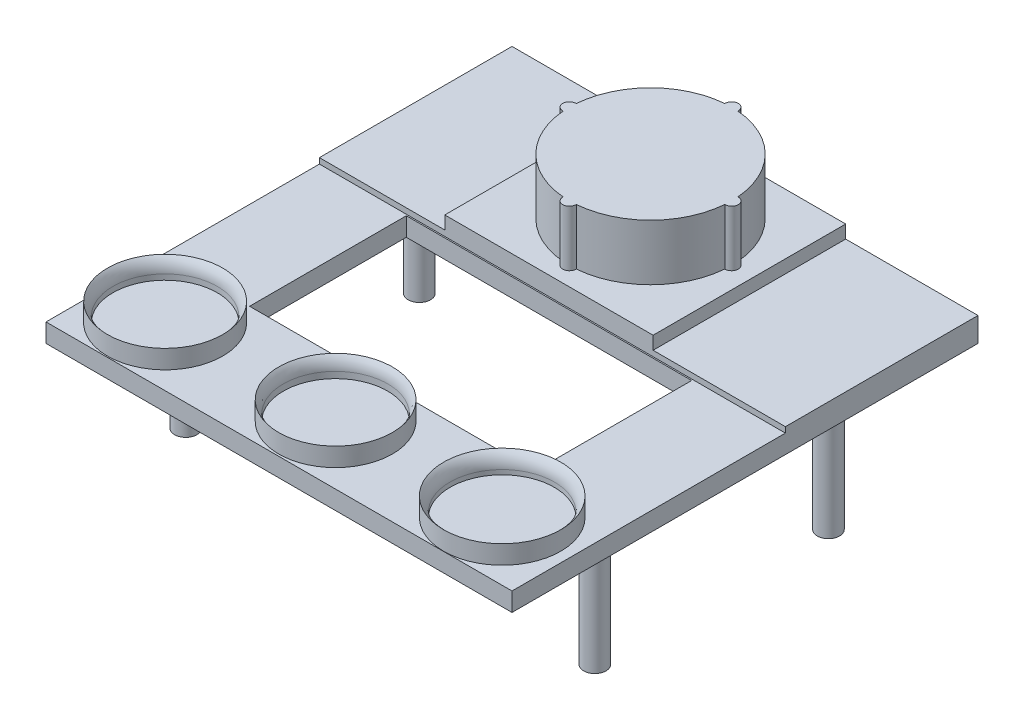
ISO-10303-21;
HEADER;
FILE_DESCRIPTION(('STEP AP214'),'2;1');
FILE_NAME('part.step','',(''),(''),'','','');
FILE_SCHEMA(('AUTOMOTIVE_DESIGN { 1 0 10303 214 1 1 1 1 }'));
ENDSEC;
DATA;
#1=APPLICATION_CONTEXT('core data for automotive mechanical design processes');
#2=APPLICATION_PROTOCOL_DEFINITION('international standard','automotive_design',2000,#1);
#3=PRODUCT_CONTEXT('',#1,'mechanical');
#4=PRODUCT('Part','Part','',(#3));
#5=PRODUCT_RELATED_PRODUCT_CATEGORY('part','',(#4));
#6=PRODUCT_DEFINITION_FORMATION('','',#4);
#7=PRODUCT_DEFINITION_CONTEXT('part definition',#1,'design');
#8=PRODUCT_DEFINITION('design','',#6,#7);
#9=PRODUCT_DEFINITION_SHAPE('','',#8);
#10=(LENGTH_UNIT() NAMED_UNIT(*) SI_UNIT(.MILLI.,.METRE.));
#11=(NAMED_UNIT(*) PLANE_ANGLE_UNIT() SI_UNIT($,.RADIAN.));
#12=(NAMED_UNIT(*) SI_UNIT($,.STERADIAN.) SOLID_ANGLE_UNIT());
#13=UNCERTAINTY_MEASURE_WITH_UNIT(LENGTH_MEASURE(1.E-05),#10,'distance_accuracy_value','');
#14=(GEOMETRIC_REPRESENTATION_CONTEXT(3) GLOBAL_UNCERTAINTY_ASSIGNED_CONTEXT((#13)) GLOBAL_UNIT_ASSIGNED_CONTEXT((#10,
#11,#12)) REPRESENTATION_CONTEXT('',''));
#15=CARTESIAN_POINT('',(0.,0.,0.));
#16=DIRECTION('',(0.,0.,1.));
#17=DIRECTION('',(1.,0.,0.));
#18=AXIS2_PLACEMENT_3D('',#15,#16,#17);
#19=CARTESIAN_POINT('',(0.,13.,0.));
#20=DIRECTION('',(0.,1.,0.));
#21=DIRECTION('',(0.,0.,1.));
#22=AXIS2_PLACEMENT_3D('',#19,#20,#21);
#23=PLANE('',#22);
#24=DIRECTION('',(1.,0.,0.));
#25=VECTOR('',#24,1.);
#26=CARTESIAN_POINT('',(0.,13.,103.325354833291));
#27=LINE('',#26,#25);
#28=CARTESIAN_POINT('',(0.,13.,103.325354833291));
#29=VERTEX_POINT('',#28);
#30=CARTESIAN_POINT('',(67.2573906105652,13.,103.325354833291));
#31=VERTEX_POINT('',#30);
#32=EDGE_CURVE('E243',#29,#31,#27,.T.);
#33=ORIENTED_EDGE('',*,*,#32,.T.);
#34=DIRECTION('',(0.,0.,-1.));
#35=VECTOR('',#34,1.);
#36=CARTESIAN_POINT('',(67.2573906105652,13.,0.));
#37=LINE('',#36,#35);
#38=CARTESIAN_POINT('',(67.2573906105652,13.,0.));
#39=VERTEX_POINT('',#38);
#40=EDGE_CURVE('E11',#31,#39,#37,.T.);
#41=ORIENTED_EDGE('',*,*,#40,.T.);
#42=DIRECTION('',(-1.,0.,0.));
#43=VECTOR('',#42,1.);
#44=CARTESIAN_POINT('',(0.,13.,0.));
#45=LINE('',#44,#43);
#46=CARTESIAN_POINT('',(0.,13.,0.));
#47=VERTEX_POINT('',#46);
#48=EDGE_CURVE('E248',#39,#47,#45,.T.);
#49=ORIENTED_EDGE('',*,*,#48,.T.);
#50=DIRECTION('',(0.,0.,1.));
#51=VECTOR('',#50,1.);
#52=CARTESIAN_POINT('',(0.,13.,0.));
#53=LINE('',#52,#51);
#54=EDGE_CURVE('E239',#47,#29,#53,.T.);
#55=ORIENTED_EDGE('',*,*,#54,.T.);
#56=EDGE_LOOP('',(#33,#41,#49,#55));
#57=FACE_BOUND('',#56,.T.);
#58=ADVANCED_FACE('F37',(#57),#23,.T.);
#59=CARTESIAN_POINT('',(250.,13.,0.));
#60=VERTEX_POINT('',#59);
#61=CARTESIAN_POINT('',(179.017279751407,13.,0.));
#62=VERTEX_POINT('',#61);
#63=EDGE_CURVE('E249',#60,#62,#45,.T.);
#64=ORIENTED_EDGE('',*,*,#63,.T.);
#65=DIRECTION('',(0.,0.,1.));
#66=VECTOR('',#65,1.);
#67=CARTESIAN_POINT('',(179.017279751407,13.,0.));
#68=LINE('',#67,#66);
#69=CARTESIAN_POINT('',(179.017279751407,13.,103.325354833291));
#70=VERTEX_POINT('',#69);
#71=EDGE_CURVE('E45',#62,#70,#68,.T.);
#72=ORIENTED_EDGE('',*,*,#71,.T.);
#73=CARTESIAN_POINT('',(250.,13.,103.325354833291));
#74=VERTEX_POINT('',#73);
#75=EDGE_CURVE('E242',#70,#74,#27,.T.);
#76=ORIENTED_EDGE('',*,*,#75,.T.);
#77=DIRECTION('',(0.,0.,-1.));
#78=VECTOR('',#77,1.);
#79=CARTESIAN_POINT('',(250.,13.,0.));
#80=LINE('',#79,#78);
#81=EDGE_CURVE('E245',#74,#60,#80,.T.);
#82=ORIENTED_EDGE('',*,*,#81,.T.);
#83=EDGE_LOOP('',(#64,#72,#76,#82));
#84=FACE_BOUND('',#83,.T.);
#85=ADVANCED_FACE('F383',(#84),#23,.T.);
#86=CARTESIAN_POINT('',(0.,10.,0.));
#87=DIRECTION('',(0.,1.,0.));
#88=DIRECTION('',(0.,0.,1.));
#89=AXIS2_PLACEMENT_3D('',#86,#87,#88);
#90=PLANE('',#89);
#91=CARTESIAN_POINT('',(213.222579155119,10.,218.471907281431));
#92=DIRECTION('',(0.,1.,0.));
#93=DIRECTION('',(0.,0.,1.));
#94=AXIS2_PLACEMENT_3D('',#91,#92,#93);
#95=CIRCLE('',#94,31.4230528856466);
#96=CARTESIAN_POINT('',(213.222579155119,10.,249.894960167077));
#97=VERTEX_POINT('',#96);
#98=EDGE_CURVE('E259',#97,#97,#95,.T.);
#99=ORIENTED_EDGE('',*,*,#98,.F.);
#100=EDGE_LOOP('',(#99));
#101=FACE_BOUND('',#100,.T.);
#102=CARTESIAN_POINT('',(32.3747585453935,10.,218.471907281431));
#103=DIRECTION('',(0.,1.,0.));
#104=DIRECTION('',(0.,0.,1.));
#105=AXIS2_PLACEMENT_3D('',#102,#103,#104);
#106=CIRCLE('',#105,30.9208109440799);
#107=CARTESIAN_POINT('',(32.3747585453935,10.,249.392718225511));
#108=VERTEX_POINT('',#107);
#109=EDGE_CURVE('E268',#108,#108,#106,.T.);
#110=ORIENTED_EDGE('',*,*,#109,.F.);
#111=EDGE_LOOP('',(#110));
#112=FACE_BOUND('',#111,.T.);
#113=DIRECTION('',(1.,0.,0.));
#114=VECTOR('',#113,1.);
#115=CARTESIAN_POINT('',(47.3310682617749,10.,188.122433439712));
#116=LINE('',#115,#114);
#117=CARTESIAN_POINT('',(126.903959479342,10.,188.122433439712));
#118=VERTEX_POINT('',#117);
#119=CARTESIAN_POINT('',(200.410245688352,10.,188.122433439712));
#120=VERTEX_POINT('',#119);
#121=EDGE_CURVE('E304',#118,#120,#116,.T.);
#122=ORIENTED_EDGE('',*,*,#121,.F.);
#123=CARTESIAN_POINT('',(123.814667842446,10.,218.471907281431));
#124=DIRECTION('',(0.,1.,0.));
#125=DIRECTION('',(0.,0.,1.));
#126=AXIS2_PLACEMENT_3D('',#123,#124,#125);
#127=CIRCLE('',#126,30.5062991083316);
#128=CARTESIAN_POINT('',(120.725376205549,10.,188.122433439712));
#129=VERTEX_POINT('',#128);
#130=EDGE_CURVE('E269',#129,#118,#127,.T.);
#131=ORIENTED_EDGE('',*,*,#130,.F.);
#132=CARTESIAN_POINT('',(47.3310682617749,10.,188.122433439712));
#133=VERTEX_POINT('',#132);
#134=EDGE_CURVE('E306',#133,#129,#116,.T.);
#135=ORIENTED_EDGE('',*,*,#134,.F.);
#136=DIRECTION('',(0.,0.,1.));
#137=VECTOR('',#136,1.);
#138=CARTESIAN_POINT('',(47.3310682617749,10.,104.023379174493));
#139=LINE('',#138,#137);
#140=CARTESIAN_POINT('',(47.3310682617749,10.,104.023379174493));
#141=VERTEX_POINT('',#140);
#142=EDGE_CURVE('E302',#141,#133,#139,.T.);
#143=ORIENTED_EDGE('',*,*,#142,.F.);
#144=DIRECTION('',(-1.,0.,0.));
#145=VECTOR('',#144,1.);
#146=CARTESIAN_POINT('',(47.3310682617749,10.,104.023379174493));
#147=LINE('',#146,#145);
#148=CARTESIAN_POINT('',(200.410245688352,10.,104.023379174493));
#149=VERTEX_POINT('',#148);
#150=EDGE_CURVE('E313',#149,#141,#147,.T.);
#151=ORIENTED_EDGE('',*,*,#150,.F.);
#152=DIRECTION('',(0.,0.,-1.));
#153=VECTOR('',#152,1.);
#154=CARTESIAN_POINT('',(200.410245688352,10.,104.023379174493));
#155=LINE('',#154,#153);
#156=EDGE_CURVE('E309',#120,#149,#155,.T.);
#157=ORIENTED_EDGE('',*,*,#156,.F.);
#158=EDGE_LOOP('',(#122,#131,#135,#143,#151,#157));
#159=FACE_BOUND('',#158,.T.);
#160=DIRECTION('',(0.,0.,-1.));
#161=VECTOR('',#160,1.);
#162=CARTESIAN_POINT('',(250.,10.,0.));
#163=LINE('',#162,#161);
#164=CARTESIAN_POINT('',(250.,10.,250.));
#165=VERTEX_POINT('',#164);
#166=CARTESIAN_POINT('',(250.,10.,103.325354833291));
#167=VERTEX_POINT('',#166);
#168=EDGE_CURVE('E341',#165,#167,#163,.T.);
#169=ORIENTED_EDGE('',*,*,#168,.T.);
#170=DIRECTION('',(1.,0.,0.));
#171=VECTOR('',#170,1.);
#172=CARTESIAN_POINT('',(0.,10.,103.325354833291));
#173=LINE('',#172,#171);
#174=CARTESIAN_POINT('',(0.,10.,103.325354833291));
#175=VERTEX_POINT('',#174);
#176=EDGE_CURVE('E238',#175,#167,#173,.T.);
#177=ORIENTED_EDGE('',*,*,#176,.F.);
#178=DIRECTION('',(0.,0.,1.));
#179=VECTOR('',#178,1.);
#180=CARTESIAN_POINT('',(0.,10.,0.));
#181=LINE('',#180,#179);
#182=CARTESIAN_POINT('',(0.,10.,250.));
#183=VERTEX_POINT('',#182);
#184=EDGE_CURVE('E336',#175,#183,#181,.T.);
#185=ORIENTED_EDGE('',*,*,#184,.T.);
#186=DIRECTION('',(1.,0.,0.));
#187=VECTOR('',#186,1.);
#188=CARTESIAN_POINT('',(0.,10.,250.));
#189=LINE('',#188,#187);
#190=EDGE_CURVE('E338',#183,#165,#189,.T.);
#191=ORIENTED_EDGE('',*,*,#190,.T.);
#192=EDGE_LOOP('',(#169,#177,#185,#191));
#193=FACE_BOUND('',#192,.T.);
#194=ADVANCED_FACE('F413',(#101,#112,#159,#193),#90,.T.);
#195=CARTESIAN_POINT('',(0.,0.,0.));
#196=DIRECTION('',(0.,1.,0.));
#197=DIRECTION('',(0.,0.,1.));
#198=AXIS2_PLACEMENT_3D('',#195,#196,#197);
#199=PLANE('',#198);
#200=DIRECTION('',(0.,0.,1.));
#201=VECTOR('',#200,1.);
#202=CARTESIAN_POINT('',(0.,0.,0.));
#203=LINE('',#202,#201);
#204=CARTESIAN_POINT('',(0.,0.,0.));
#205=VERTEX_POINT('',#204);
#206=CARTESIAN_POINT('',(0.,0.,250.));
#207=VERTEX_POINT('',#206);
#208=EDGE_CURVE('E335',#205,#207,#203,.T.);
#209=ORIENTED_EDGE('',*,*,#208,.F.);
#210=DIRECTION('',(-1.,0.,0.));
#211=VECTOR('',#210,1.);
#212=CARTESIAN_POINT('',(0.,0.,0.));
#213=LINE('',#212,#211);
#214=CARTESIAN_POINT('',(250.,0.,0.));
#215=VERTEX_POINT('',#214);
#216=EDGE_CURVE('E339',#215,#205,#213,.T.);
#217=ORIENTED_EDGE('',*,*,#216,.F.);
#218=DIRECTION('',(0.,0.,-1.));
#219=VECTOR('',#218,1.);
#220=CARTESIAN_POINT('',(250.,0.,0.));
#221=LINE('',#220,#219);
#222=CARTESIAN_POINT('',(250.,0.,250.));
#223=VERTEX_POINT('',#222);
#224=EDGE_CURVE('E349',#223,#215,#221,.T.);
#225=ORIENTED_EDGE('',*,*,#224,.F.);
#226=DIRECTION('',(1.,0.,0.));
#227=VECTOR('',#226,1.);
#228=CARTESIAN_POINT('',(0.,0.,250.));
#229=LINE('',#228,#227);
#230=EDGE_CURVE('E347',#207,#223,#229,.T.);
#231=ORIENTED_EDGE('',*,*,#230,.F.);
#232=EDGE_LOOP('',(#209,#217,#225,#231));
#233=FACE_BOUND('',#232,.T.);
#234=DIRECTION('',(0.,0.,1.));
#235=VECTOR('',#234,1.);
#236=CARTESIAN_POINT('',(47.3310682617749,0.,104.023379174493));
#237=LINE('',#236,#235);
#238=CARTESIAN_POINT('',(47.3310682617749,0.,104.023379174493));
#239=VERTEX_POINT('',#238);
#240=CARTESIAN_POINT('',(47.3310682617749,0.,188.122433439712));
#241=VERTEX_POINT('',#240);
#242=EDGE_CURVE('E299',#239,#241,#237,.T.);
#243=ORIENTED_EDGE('',*,*,#242,.T.);
#244=DIRECTION('',(1.,0.,0.));
#245=VECTOR('',#244,1.);
#246=CARTESIAN_POINT('',(47.3310682617749,0.,188.122433439712));
#247=LINE('',#246,#245);
#248=CARTESIAN_POINT('',(200.410245688352,0.,188.122433439712));
#249=VERTEX_POINT('',#248);
#250=EDGE_CURVE('E318',#241,#249,#247,.T.);
#251=ORIENTED_EDGE('',*,*,#250,.T.);
#252=DIRECTION('',(0.,0.,-1.));
#253=VECTOR('',#252,1.);
#254=CARTESIAN_POINT('',(200.410245688352,0.,104.023379174493));
#255=LINE('',#254,#253);
#256=CARTESIAN_POINT('',(200.410245688352,0.,104.023379174493));
#257=VERTEX_POINT('',#256);
#258=EDGE_CURVE('E321',#249,#257,#255,.T.);
#259=ORIENTED_EDGE('',*,*,#258,.T.);
#260=DIRECTION('',(-1.,0.,0.));
#261=VECTOR('',#260,1.);
#262=CARTESIAN_POINT('',(47.3310682617749,0.,104.023379174493));
#263=LINE('',#262,#261);
#264=EDGE_CURVE('E305',#257,#239,#263,.T.);
#265=ORIENTED_EDGE('',*,*,#264,.T.);
#266=EDGE_LOOP('',(#243,#251,#259,#265));
#267=FACE_BOUND('',#266,.T.);
#268=CARTESIAN_POINT('',(11.9090744526915,0.,61.6016628873772));
#269=DIRECTION('',(0.,1.,0.));
#270=DIRECTION('',(0.,0.,1.));
#271=AXIS2_PLACEMENT_3D('',#268,#269,#270);
#272=CIRCLE('',#271,6.);
#273=CARTESIAN_POINT('',(11.9090744526915,0.,67.6016628873772));
#274=VERTEX_POINT('',#273);
#275=EDGE_CURVE('E293',#274,#274,#272,.T.);
#276=ORIENTED_EDGE('',*,*,#275,.T.);
#277=EDGE_LOOP('',(#276));
#278=FACE_BOUND('',#277,.T.);
#279=CARTESIAN_POINT('',(231.364856765617,0.,61.6016628873772));
#280=DIRECTION('',(0.,1.,0.));
#281=DIRECTION('',(0.,0.,1.));
#282=AXIS2_PLACEMENT_3D('',#279,#280,#281);
#283=CIRCLE('',#282,6.00000000000002);
#284=CARTESIAN_POINT('',(231.364856765617,0.,67.6016628873772));
#285=VERTEX_POINT('',#284);
#286=EDGE_CURVE('E290',#285,#285,#283,.T.);
#287=ORIENTED_EDGE('',*,*,#286,.T.);
#288=EDGE_LOOP('',(#287));
#289=FACE_BOUND('',#288,.T.);
#290=CARTESIAN_POINT('',(231.364856765617,0.,186.93529856387));
#291=DIRECTION('',(0.,1.,0.));
#292=DIRECTION('',(0.,0.,1.));
#293=AXIS2_PLACEMENT_3D('',#290,#291,#292);
#294=CIRCLE('',#293,6.00000000000002);
#295=CARTESIAN_POINT('',(231.364856765617,0.,192.93529856387));
#296=VERTEX_POINT('',#295);
#297=EDGE_CURVE('E284',#296,#296,#294,.T.);
#298=ORIENTED_EDGE('',*,*,#297,.T.);
#299=EDGE_LOOP('',(#298));
#300=FACE_BOUND('',#299,.T.);
#301=CARTESIAN_POINT('',(11.9090744526915,0.,186.93529856387));
#302=DIRECTION('',(0.,1.,0.));
#303=DIRECTION('',(0.,0.,1.));
#304=AXIS2_PLACEMENT_3D('',#301,#302,#303);
#305=CIRCLE('',#304,6.);
#306=CARTESIAN_POINT('',(11.9090744526915,0.,192.93529856387));
#307=VERTEX_POINT('',#306);
#308=EDGE_CURVE('E278',#307,#307,#305,.T.);
#309=ORIENTED_EDGE('',*,*,#308,.T.);
#310=EDGE_LOOP('',(#309));
#311=FACE_BOUND('',#310,.T.);
#312=ADVANCED_FACE('F423',(#233,#267,#278,#289,#300,#311),#199,.F.);
#313=CARTESIAN_POINT('',(0.,10.,0.));
#314=DIRECTION('',(1.,0.,0.));
#315=DIRECTION('',(0.,0.,-1.));
#316=AXIS2_PLACEMENT_3D('',#313,#314,#315);
#317=PLANE('',#316);
#318=ORIENTED_EDGE('',*,*,#208,.T.);
#319=DIRECTION('',(0.,-1.,0.));
#320=VECTOR('',#319,1.);
#321=CARTESIAN_POINT('',(0.,10.,250.));
#322=LINE('',#321,#320);
#323=EDGE_CURVE('E360',#183,#207,#322,.T.);
#324=ORIENTED_EDGE('',*,*,#323,.F.);
#325=ORIENTED_EDGE('',*,*,#184,.F.);
#326=DIRECTION('',(0.,-1.,0.));
#327=VECTOR('',#326,1.);
#328=CARTESIAN_POINT('',(0.,13.,103.325354833291));
#329=LINE('',#328,#327);
#330=EDGE_CURVE('E255',#29,#175,#329,.T.);
#331=ORIENTED_EDGE('',*,*,#330,.F.);
#332=ORIENTED_EDGE('',*,*,#54,.F.);
#333=DIRECTION('',(0.,-1.,0.));
#334=VECTOR('',#333,1.);
#335=CARTESIAN_POINT('',(0.,10.,0.));
#336=LINE('',#335,#334);
#337=EDGE_CURVE('E344',#47,#205,#336,.T.);
#338=ORIENTED_EDGE('',*,*,#337,.T.);
#339=EDGE_LOOP('',(#318,#324,#325,#331,#332,#338));
#340=FACE_BOUND('',#339,.T.);
#341=ADVANCED_FACE('F409',(#340),#317,.F.);
#342=CARTESIAN_POINT('',(0.,10.,250.));
#343=DIRECTION('',(0.,0.,-1.));
#344=DIRECTION('',(-1.,0.,0.));
#345=AXIS2_PLACEMENT_3D('',#342,#343,#344);
#346=PLANE('',#345);
#347=ORIENTED_EDGE('',*,*,#230,.T.);
#348=DIRECTION('',(0.,-1.,0.));
#349=VECTOR('',#348,1.);
#350=CARTESIAN_POINT('',(250.,10.,250.));
#351=LINE('',#350,#349);
#352=EDGE_CURVE('E357',#165,#223,#351,.T.);
#353=ORIENTED_EDGE('',*,*,#352,.F.);
#354=ORIENTED_EDGE('',*,*,#190,.F.);
#355=ORIENTED_EDGE('',*,*,#323,.T.);
#356=EDGE_LOOP('',(#347,#353,#354,#355));
#357=FACE_BOUND('',#356,.T.);
#358=ADVANCED_FACE('F427',(#357),#346,.F.);
#359=CARTESIAN_POINT('',(250.,10.,0.));
#360=DIRECTION('',(-1.,0.,0.));
#361=DIRECTION('',(0.,0.,1.));
#362=AXIS2_PLACEMENT_3D('',#359,#360,#361);
#363=PLANE('',#362);
#364=ORIENTED_EDGE('',*,*,#224,.T.);
#365=DIRECTION('',(0.,-1.,0.));
#366=VECTOR('',#365,1.);
#367=CARTESIAN_POINT('',(250.,10.,0.));
#368=LINE('',#367,#366);
#369=EDGE_CURVE('E354',#60,#215,#368,.T.);
#370=ORIENTED_EDGE('',*,*,#369,.F.);
#371=ORIENTED_EDGE('',*,*,#81,.F.);
#372=DIRECTION('',(0.,-1.,0.));
#373=VECTOR('',#372,1.);
#374=CARTESIAN_POINT('',(250.,13.,103.325354833291));
#375=LINE('',#374,#373);
#376=EDGE_CURVE('E251',#74,#167,#375,.T.);
#377=ORIENTED_EDGE('',*,*,#376,.T.);
#378=ORIENTED_EDGE('',*,*,#168,.F.);
#379=ORIENTED_EDGE('',*,*,#352,.T.);
#380=EDGE_LOOP('',(#364,#370,#371,#377,#378,#379));
#381=FACE_BOUND('',#380,.T.);
#382=ADVANCED_FACE('F417',(#381),#363,.F.);
#383=CARTESIAN_POINT('',(0.,10.,0.));
#384=DIRECTION('',(0.,0.,1.));
#385=DIRECTION('',(1.,0.,0.));
#386=AXIS2_PLACEMENT_3D('',#383,#384,#385);
#387=PLANE('',#386);
#388=ORIENTED_EDGE('',*,*,#216,.T.);
#389=ORIENTED_EDGE('',*,*,#337,.F.);
#390=ORIENTED_EDGE('',*,*,#48,.F.);
#391=DIRECTION('',(0.,-1.,0.));
#392=VECTOR('',#391,1.);
#393=CARTESIAN_POINT('',(67.2573906105652,20.,0.));
#394=LINE('',#393,#392);
#395=CARTESIAN_POINT('',(67.2573906105652,20.,0.));
#396=VERTEX_POINT('',#395);
#397=EDGE_CURVE('E226',#396,#39,#394,.T.);
#398=ORIENTED_EDGE('',*,*,#397,.F.);
#399=DIRECTION('',(-1.,0.,0.));
#400=VECTOR('',#399,1.);
#401=CARTESIAN_POINT('',(67.2573906105652,20.,0.));
#402=LINE('',#401,#400);
#403=CARTESIAN_POINT('',(179.017279751407,20.,0.));
#404=VERTEX_POINT('',#403);
#405=EDGE_CURVE('E224',#404,#396,#402,.T.);
#406=ORIENTED_EDGE('',*,*,#405,.F.);
#407=DIRECTION('',(0.,-1.,0.));
#408=VECTOR('',#407,1.);
#409=CARTESIAN_POINT('',(179.017279751407,20.,0.));
#410=LINE('',#409,#408);
#411=EDGE_CURVE('E229',#404,#62,#410,.T.);
#412=ORIENTED_EDGE('',*,*,#411,.T.);
#413=ORIENTED_EDGE('',*,*,#63,.F.);
#414=ORIENTED_EDGE('',*,*,#369,.T.);
#415=EDGE_LOOP('',(#388,#389,#390,#398,#406,#412,#413,#414));
#416=FACE_BOUND('',#415,.T.);
#417=ADVANCED_FACE('F419',(#416),#387,.F.);
#418=CARTESIAN_POINT('',(47.3310682617749,10.,104.023379174493));
#419=DIRECTION('',(1.,0.,0.));
#420=DIRECTION('',(0.,0.,-1.));
#421=AXIS2_PLACEMENT_3D('',#418,#419,#420);
#422=PLANE('',#421);
#423=ORIENTED_EDGE('',*,*,#242,.F.);
#424=DIRECTION('',(0.,-1.,0.));
#425=VECTOR('',#424,1.);
#426=CARTESIAN_POINT('',(47.3310682617749,10.,104.023379174493));
#427=LINE('',#426,#425);
#428=EDGE_CURVE('E315',#141,#239,#427,.T.);
#429=ORIENTED_EDGE('',*,*,#428,.F.);
#430=ORIENTED_EDGE('',*,*,#142,.T.);
#431=DIRECTION('',(0.,-1.,0.));
#432=VECTOR('',#431,1.);
#433=CARTESIAN_POINT('',(47.3310682617749,10.,188.122433439712));
#434=LINE('',#433,#432);
#435=EDGE_CURVE('E332',#133,#241,#434,.T.);
#436=ORIENTED_EDGE('',*,*,#435,.T.);
#437=EDGE_LOOP('',(#423,#429,#430,#436));
#438=FACE_BOUND('',#437,.T.);
#439=ADVANCED_FACE('F520',(#438),#422,.T.);
#440=CARTESIAN_POINT('',(47.3310682617749,10.,188.122433439712));
#441=DIRECTION('',(0.,0.,-1.));
#442=DIRECTION('',(-1.,0.,0.));
#443=AXIS2_PLACEMENT_3D('',#440,#441,#442);
#444=PLANE('',#443);
#445=ORIENTED_EDGE('',*,*,#250,.F.);
#446=ORIENTED_EDGE('',*,*,#435,.F.);
#447=ORIENTED_EDGE('',*,*,#134,.T.);
#448=EDGE_CURVE('E310',#129,#118,#116,.T.);
#449=ORIENTED_EDGE('',*,*,#448,.T.);
#450=ORIENTED_EDGE('',*,*,#121,.T.);
#451=DIRECTION('',(0.,-1.,0.));
#452=VECTOR('',#451,1.);
#453=CARTESIAN_POINT('',(200.410245688352,10.,188.122433439712));
#454=LINE('',#453,#452);
#455=EDGE_CURVE('E330',#120,#249,#454,.T.);
#456=ORIENTED_EDGE('',*,*,#455,.T.);
#457=EDGE_LOOP('',(#445,#446,#447,#449,#450,#456));
#458=FACE_BOUND('',#457,.T.);
#459=ADVANCED_FACE('F516',(#458),#444,.T.);
#460=CARTESIAN_POINT('',(200.410245688352,10.,104.023379174493));
#461=DIRECTION('',(-1.,0.,0.));
#462=DIRECTION('',(0.,0.,1.));
#463=AXIS2_PLACEMENT_3D('',#460,#461,#462);
#464=PLANE('',#463);
#465=ORIENTED_EDGE('',*,*,#258,.F.);
#466=ORIENTED_EDGE('',*,*,#455,.F.);
#467=ORIENTED_EDGE('',*,*,#156,.T.);
#468=DIRECTION('',(0.,-1.,0.));
#469=VECTOR('',#468,1.);
#470=CARTESIAN_POINT('',(200.410245688352,10.,104.023379174493));
#471=LINE('',#470,#469);
#472=EDGE_CURVE('E328',#149,#257,#471,.T.);
#473=ORIENTED_EDGE('',*,*,#472,.T.);
#474=EDGE_LOOP('',(#465,#466,#467,#473));
#475=FACE_BOUND('',#474,.T.);
#476=ADVANCED_FACE('F512',(#475),#464,.T.);
#477=CARTESIAN_POINT('',(47.3310682617749,10.,104.023379174493));
#478=DIRECTION('',(0.,0.,1.));
#479=DIRECTION('',(1.,0.,0.));
#480=AXIS2_PLACEMENT_3D('',#477,#478,#479);
#481=PLANE('',#480);
#482=ORIENTED_EDGE('',*,*,#264,.F.);
#483=ORIENTED_EDGE('',*,*,#472,.F.);
#484=ORIENTED_EDGE('',*,*,#150,.T.);
#485=ORIENTED_EDGE('',*,*,#428,.T.);
#486=EDGE_LOOP('',(#482,#483,#484,#485));
#487=FACE_BOUND('',#486,.T.);
#488=ADVANCED_FACE('F508',(#487),#481,.T.);
#489=CARTESIAN_POINT('',(11.9090744526915,-65.,61.6016628873772));
#490=DIRECTION('',(0.,1.,0.));
#491=DIRECTION('',(0.,0.,1.));
#492=AXIS2_PLACEMENT_3D('',#489,#490,#491);
#493=CYLINDRICAL_SURFACE('',#492,6.);
#494=CARTESIAN_POINT('',(11.9090744526915,-65.,61.6016628873772));
#495=DIRECTION('',(0.,1.,0.));
#496=DIRECTION('',(0.,0.,1.));
#497=AXIS2_PLACEMENT_3D('',#494,#495,#496);
#498=CIRCLE('',#497,6.);
#499=CARTESIAN_POINT('',(11.9090744526915,-65.,67.6016628873772));
#500=VERTEX_POINT('',#499);
#501=EDGE_CURVE('E296',#500,#500,#498,.T.);
#502=ORIENTED_EDGE('',*,*,#501,.T.);
#503=EDGE_LOOP('',(#502));
#504=FACE_BOUND('',#503,.T.);
#505=ORIENTED_EDGE('',*,*,#275,.F.);
#506=EDGE_LOOP('',(#505));
#507=FACE_BOUND('',#506,.T.);
#508=ADVANCED_FACE('F504',(#504,#507),#493,.T.);
#509=CARTESIAN_POINT('',(11.9090744526915,-65.,61.6016628873772));
#510=DIRECTION('',(0.,1.,0.));
#511=DIRECTION('',(0.,0.,1.));
#512=AXIS2_PLACEMENT_3D('',#509,#510,#511);
#513=PLANE('',#512);
#514=ORIENTED_EDGE('',*,*,#501,.F.);
#515=EDGE_LOOP('',(#514));
#516=FACE_BOUND('',#515,.T.);
#517=ADVANCED_FACE('F497',(#516),#513,.F.);
#518=CARTESIAN_POINT('',(231.364856765617,-65.,61.6016628873772));
#519=DIRECTION('',(0.,1.,0.));
#520=DIRECTION('',(0.,0.,1.));
#521=AXIS2_PLACEMENT_3D('',#518,#519,#520);
#522=CYLINDRICAL_SURFACE('',#521,6.00000000000002);
#523=CARTESIAN_POINT('',(231.364856765617,-65.,61.6016628873772));
#524=DIRECTION('',(0.,1.,0.));
#525=DIRECTION('',(0.,0.,1.));
#526=AXIS2_PLACEMENT_3D('',#523,#524,#525);
#527=CIRCLE('',#526,6.00000000000002);
#528=CARTESIAN_POINT('',(231.364856765617,-65.,67.6016628873772));
#529=VERTEX_POINT('',#528);
#530=EDGE_CURVE('E287',#529,#529,#527,.T.);
#531=ORIENTED_EDGE('',*,*,#530,.T.);
#532=EDGE_LOOP('',(#531));
#533=FACE_BOUND('',#532,.T.);
#534=ORIENTED_EDGE('',*,*,#286,.F.);
#535=EDGE_LOOP('',(#534));
#536=FACE_BOUND('',#535,.T.);
#537=ADVANCED_FACE('F494',(#533,#536),#522,.T.);
#538=CARTESIAN_POINT('',(231.364856765617,-65.,61.6016628873772));
#539=DIRECTION('',(0.,1.,0.));
#540=DIRECTION('',(0.,0.,1.));
#541=AXIS2_PLACEMENT_3D('',#538,#539,#540);
#542=PLANE('',#541);
#543=ORIENTED_EDGE('',*,*,#530,.F.);
#544=EDGE_LOOP('',(#543));
#545=FACE_BOUND('',#544,.T.);
#546=ADVANCED_FACE('F489',(#545),#542,.F.);
#547=CARTESIAN_POINT('',(231.364856765617,-65.,186.93529856387));
#548=DIRECTION('',(0.,1.,0.));
#549=DIRECTION('',(0.,0.,1.));
#550=AXIS2_PLACEMENT_3D('',#547,#548,#549);
#551=CYLINDRICAL_SURFACE('',#550,6.00000000000002);
#552=CARTESIAN_POINT('',(231.364856765617,-65.,186.93529856387));
#553=DIRECTION('',(0.,1.,0.));
#554=DIRECTION('',(0.,0.,1.));
#555=AXIS2_PLACEMENT_3D('',#552,#553,#554);
#556=CIRCLE('',#555,6.00000000000002);
#557=CARTESIAN_POINT('',(231.364856765617,-65.,192.93529856387));
#558=VERTEX_POINT('',#557);
#559=EDGE_CURVE('E281',#558,#558,#556,.T.);
#560=ORIENTED_EDGE('',*,*,#559,.T.);
#561=EDGE_LOOP('',(#560));
#562=FACE_BOUND('',#561,.T.);
#563=ORIENTED_EDGE('',*,*,#297,.F.);
#564=EDGE_LOOP('',(#563));
#565=FACE_BOUND('',#564,.T.);
#566=ADVANCED_FACE('F486',(#562,#565),#551,.T.);
#567=CARTESIAN_POINT('',(231.364856765617,-65.,186.93529856387));
#568=DIRECTION('',(0.,1.,0.));
#569=DIRECTION('',(0.,0.,1.));
#570=AXIS2_PLACEMENT_3D('',#567,#568,#569);
#571=PLANE('',#570);
#572=ORIENTED_EDGE('',*,*,#559,.F.);
#573=EDGE_LOOP('',(#572));
#574=FACE_BOUND('',#573,.T.);
#575=ADVANCED_FACE('F481',(#574),#571,.F.);
#576=CARTESIAN_POINT('',(11.9090744526915,-65.,186.93529856387));
#577=DIRECTION('',(0.,1.,0.));
#578=DIRECTION('',(0.,0.,1.));
#579=AXIS2_PLACEMENT_3D('',#576,#577,#578);
#580=CYLINDRICAL_SURFACE('',#579,6.);
#581=CARTESIAN_POINT('',(11.9090744526915,-65.,186.93529856387));
#582=DIRECTION('',(0.,1.,0.));
#583=DIRECTION('',(0.,0.,1.));
#584=AXIS2_PLACEMENT_3D('',#581,#582,#583);
#585=CIRCLE('',#584,6.);
#586=CARTESIAN_POINT('',(11.9090744526915,-65.,192.93529856387));
#587=VERTEX_POINT('',#586);
#588=EDGE_CURVE('E275',#587,#587,#585,.T.);
#589=ORIENTED_EDGE('',*,*,#588,.T.);
#590=EDGE_LOOP('',(#589));
#591=FACE_BOUND('',#590,.T.);
#592=ORIENTED_EDGE('',*,*,#308,.F.);
#593=EDGE_LOOP('',(#592));
#594=FACE_BOUND('',#593,.T.);
#595=ADVANCED_FACE('F478',(#591,#594),#580,.T.);
#596=CARTESIAN_POINT('',(11.9090744526915,-65.,186.93529856387));
#597=DIRECTION('',(0.,1.,0.));
#598=DIRECTION('',(0.,0.,1.));
#599=AXIS2_PLACEMENT_3D('',#596,#597,#598);
#600=PLANE('',#599);
#601=ORIENTED_EDGE('',*,*,#588,.F.);
#602=EDGE_LOOP('',(#601));
#603=FACE_BOUND('',#602,.T.);
#604=ADVANCED_FACE('F476',(#603),#600,.F.);
#605=CARTESIAN_POINT('',(32.3747585453935,20.,218.471907281431));
#606=DIRECTION('',(0.,-1.,0.));
#607=DIRECTION('',(0.,0.,-1.));
#608=AXIS2_PLACEMENT_3D('',#605,#606,#607);
#609=CYLINDRICAL_SURFACE('',#608,30.9208109440799);
#610=CARTESIAN_POINT('',(32.3747585453935,20.,218.471907281431));
#611=DIRECTION('',(0.,1.,0.));
#612=DIRECTION('',(0.,0.,1.));
#613=AXIS2_PLACEMENT_3D('',#610,#611,#612);
#614=CIRCLE('',#613,30.9208109440799);
#615=CARTESIAN_POINT('',(32.3747585453935,20.,249.392718225511));
#616=VERTEX_POINT('',#615);
#617=EDGE_CURVE('E272',#616,#616,#614,.T.);
#618=ORIENTED_EDGE('',*,*,#617,.F.);
#619=EDGE_LOOP('',(#618));
#620=FACE_BOUND('',#619,.T.);
#621=ORIENTED_EDGE('',*,*,#109,.T.);
#622=EDGE_LOOP('',(#621));
#623=FACE_BOUND('',#622,.T.);
#624=ADVANCED_FACE('F472',(#620,#623),#609,.T.);
#625=CARTESIAN_POINT('',(32.3747585453935,20.,218.471907281431));
#626=DIRECTION('',(0.,-1.,0.));
#627=DIRECTION('',(0.,0.,-1.));
#628=AXIS2_PLACEMENT_3D('',#625,#626,#627);
#629=CYLINDRICAL_SURFACE('',#628,28.);
#630=CARTESIAN_POINT('',(32.3747585453935,12.93706277031,218.471907281431));
#631=DIRECTION('',(0.,1.,0.));
#632=DIRECTION('',(0.,0.,1.));
#633=AXIS2_PLACEMENT_3D('',#630,#631,#632);
#634=CIRCLE('',#633,28.);
#635=CARTESIAN_POINT('',(32.3747585453935,12.93706277031,246.471907281431));
#636=VERTEX_POINT('',#635);
#637=EDGE_CURVE('E378',#636,#636,#634,.T.);
#638=ORIENTED_EDGE('',*,*,#637,.T.);
#639=EDGE_LOOP('',(#638));
#640=FACE_BOUND('',#639,.T.);
#641=CARTESIAN_POINT('',(32.3747585453935,10.,218.471907281431));
#642=DIRECTION('',(0.,1.,0.));
#643=DIRECTION('',(0.,0.,1.));
#644=AXIS2_PLACEMENT_3D('',#641,#642,#643);
#645=CIRCLE('',#644,28.);
#646=CARTESIAN_POINT('',(32.3747585453935,10.,246.471907281431));
#647=VERTEX_POINT('',#646);
#648=EDGE_CURVE('E363',#647,#647,#645,.F.);
#649=ORIENTED_EDGE('',*,*,#648,.T.);
#650=EDGE_LOOP('',(#649));
#651=FACE_BOUND('',#650,.T.);
#652=ADVANCED_FACE('F469',(#640,#651),#629,.F.);
#653=ORIENTED_EDGE('',*,*,#648,.F.);
#654=EDGE_LOOP('',(#653));
#655=FACE_BOUND('',#654,.T.);
#656=ADVANCED_FACE('F464',(#655),#90,.T.);
#657=CARTESIAN_POINT('',(123.814667842446,10.,218.471907281431));
#658=DIRECTION('',(0.,1.,0.));
#659=DIRECTION('',(0.,0.,1.));
#660=AXIS2_PLACEMENT_3D('',#657,#658,#659);
#661=PLANE('',#660);
#662=ORIENTED_EDGE('',*,*,#448,.F.);
#663=EDGE_CURVE('E265',#118,#129,#127,.T.);
#664=ORIENTED_EDGE('',*,*,#663,.F.);
#665=EDGE_LOOP('',(#662,#664));
#666=FACE_BOUND('',#665,.T.);
#667=ADVANCED_FACE('F460',(#666),#661,.F.);
#668=CARTESIAN_POINT('',(123.814667842446,20.,218.471907281431));
#669=DIRECTION('',(0.,-1.,0.));
#670=DIRECTION('',(0.,0.,-1.));
#671=AXIS2_PLACEMENT_3D('',#668,#669,#670);
#672=CYLINDRICAL_SURFACE('',#671,30.5062991083316);
#673=CARTESIAN_POINT('',(123.814667842446,20.,218.471907281431));
#674=DIRECTION('',(0.,1.,0.));
#675=DIRECTION('',(0.,0.,1.));
#676=AXIS2_PLACEMENT_3D('',#673,#674,#675);
#677=CIRCLE('',#676,30.5062991083316);
#678=CARTESIAN_POINT('',(123.814667842446,20.,248.978206389762));
#679=VERTEX_POINT('',#678);
#680=EDGE_CURVE('E262',#679,#679,#677,.T.);
#681=ORIENTED_EDGE('',*,*,#680,.F.);
#682=EDGE_LOOP('',(#681));
#683=FACE_BOUND('',#682,.T.);
#684=ORIENTED_EDGE('',*,*,#663,.T.);
#685=ORIENTED_EDGE('',*,*,#130,.T.);
#686=EDGE_LOOP('',(#684,#685));
#687=FACE_BOUND('',#686,.T.);
#688=ADVANCED_FACE('F456',(#683,#687),#672,.T.);
#689=CARTESIAN_POINT('',(123.814667842446,20.,218.471907281431));
#690=DIRECTION('',(0.,-1.,0.));
#691=DIRECTION('',(0.,0.,-1.));
#692=AXIS2_PLACEMENT_3D('',#689,#690,#691);
#693=CYLINDRICAL_SURFACE('',#692,28.);
#694=CARTESIAN_POINT('',(123.814667842446,13.3784860533102,218.471907281431));
#695=DIRECTION('',(0.,1.,0.));
#696=DIRECTION('',(0.,0.,1.));
#697=AXIS2_PLACEMENT_3D('',#694,#695,#696);
#698=CIRCLE('',#697,28.);
#699=CARTESIAN_POINT('',(123.814667842446,13.3784860533102,246.471907281431));
#700=VERTEX_POINT('',#699);
#701=EDGE_CURVE('E375',#700,#700,#698,.T.);
#702=ORIENTED_EDGE('',*,*,#701,.T.);
#703=EDGE_LOOP('',(#702));
#704=FACE_BOUND('',#703,.T.);
#705=CARTESIAN_POINT('',(123.814667842446,10.,218.471907281431));
#706=DIRECTION('',(0.,1.,0.));
#707=DIRECTION('',(0.,0.,1.));
#708=AXIS2_PLACEMENT_3D('',#705,#706,#707);
#709=CIRCLE('',#708,28.);
#710=CARTESIAN_POINT('',(123.814667842446,10.,246.471907281431));
#711=VERTEX_POINT('',#710);
#712=EDGE_CURVE('E366',#711,#711,#709,.F.);
#713=ORIENTED_EDGE('',*,*,#712,.T.);
#714=EDGE_LOOP('',(#713));
#715=FACE_BOUND('',#714,.T.);
#716=ADVANCED_FACE('F459',(#704,#715),#693,.F.);
#717=ORIENTED_EDGE('',*,*,#712,.F.);
#718=EDGE_LOOP('',(#717));
#719=FACE_BOUND('',#718,.T.);
#720=ADVANCED_FACE('F450',(#719),#90,.T.);
#721=CARTESIAN_POINT('',(213.222579155119,20.,218.471907281431));
#722=DIRECTION('',(0.,-1.,0.));
#723=DIRECTION('',(0.,0.,-1.));
#724=AXIS2_PLACEMENT_3D('',#721,#722,#723);
#725=CYLINDRICAL_SURFACE('',#724,31.4230528856466);
#726=CARTESIAN_POINT('',(213.222579155119,20.,218.471907281431));
#727=DIRECTION('',(0.,1.,0.));
#728=DIRECTION('',(0.,0.,1.));
#729=AXIS2_PLACEMENT_3D('',#726,#727,#728);
#730=CIRCLE('',#729,31.4230528856466);
#731=CARTESIAN_POINT('',(213.222579155119,20.,249.894960167077));
#732=VERTEX_POINT('',#731);
#733=EDGE_CURVE('E258',#732,#732,#730,.T.);
#734=ORIENTED_EDGE('',*,*,#733,.F.);
#735=EDGE_LOOP('',(#734));
#736=FACE_BOUND('',#735,.T.);
#737=ORIENTED_EDGE('',*,*,#98,.T.);
#738=EDGE_LOOP('',(#737));
#739=FACE_BOUND('',#738,.T.);
#740=ADVANCED_FACE('F446',(#736,#739),#725,.T.);
#741=CARTESIAN_POINT('',(213.222579155119,20.,218.471907281431));
#742=DIRECTION('',(0.,-1.,0.));
#743=DIRECTION('',(0.,0.,-1.));
#744=AXIS2_PLACEMENT_3D('',#741,#742,#743);
#745=CYLINDRICAL_SURFACE('',#744,28.);
#746=CARTESIAN_POINT('',(213.222579155119,12.4671541463403,218.471907281431));
#747=DIRECTION('',(0.,1.,0.));
#748=DIRECTION('',(0.,0.,1.));
#749=AXIS2_PLACEMENT_3D('',#746,#747,#748);
#750=CIRCLE('',#749,28.);
#751=CARTESIAN_POINT('',(213.222579155119,12.4671541463403,246.471907281431));
#752=VERTEX_POINT('',#751);
#753=EDGE_CURVE('E372',#752,#752,#750,.T.);
#754=ORIENTED_EDGE('',*,*,#753,.T.);
#755=EDGE_LOOP('',(#754));
#756=FACE_BOUND('',#755,.T.);
#757=CARTESIAN_POINT('',(213.222579155119,10.,218.471907281431));
#758=DIRECTION('',(0.,1.,0.));
#759=DIRECTION('',(0.,0.,1.));
#760=AXIS2_PLACEMENT_3D('',#757,#758,#759);
#761=CIRCLE('',#760,28.);
#762=CARTESIAN_POINT('',(213.222579155119,10.,246.471907281431));
#763=VERTEX_POINT('',#762);
#764=EDGE_CURVE('E369',#763,#763,#761,.F.);
#765=ORIENTED_EDGE('',*,*,#764,.T.);
#766=EDGE_LOOP('',(#765));
#767=FACE_BOUND('',#766,.T.);
#768=ADVANCED_FACE('F449',(#756,#767),#745,.F.);
#769=ORIENTED_EDGE('',*,*,#764,.F.);
#770=EDGE_LOOP('',(#769));
#771=FACE_BOUND('',#770,.T.);
#772=ADVANCED_FACE('F454',(#771),#90,.T.);
#773=CARTESIAN_POINT('',(213.222579155119,12.4671541463403,218.471907281431));
#774=DIRECTION('',(0.,1.,0.));
#775=DIRECTION('',(0.,0.,1.));
#776=AXIS2_PLACEMENT_3D('',#773,#774,#775);
#777=TOROIDAL_SURFACE('',#776,38.,10.);
#778=ORIENTED_EDGE('',*,*,#733,.T.);
#779=EDGE_LOOP('',(#778));
#780=FACE_BOUND('',#779,.T.);
#781=ORIENTED_EDGE('',*,*,#753,.F.);
#782=EDGE_LOOP('',(#781));
#783=FACE_BOUND('',#782,.T.);
#784=ADVANCED_FACE('F632',(#780,#783),#777,.T.);
#785=CARTESIAN_POINT('',(123.814667842446,13.3784860533102,218.471907281431));
#786=DIRECTION('',(0.,1.,0.));
#787=DIRECTION('',(0.,0.,1.));
#788=AXIS2_PLACEMENT_3D('',#785,#786,#787);
#789=TOROIDAL_SURFACE('',#788,38.,10.);
#790=ORIENTED_EDGE('',*,*,#680,.T.);
#791=EDGE_LOOP('',(#790));
#792=FACE_BOUND('',#791,.T.);
#793=ORIENTED_EDGE('',*,*,#701,.F.);
#794=EDGE_LOOP('',(#793));
#795=FACE_BOUND('',#794,.T.);
#796=ADVANCED_FACE('F638',(#792,#795),#789,.T.);
#797=CARTESIAN_POINT('',(32.3747585453935,12.93706277031,218.471907281431));
#798=DIRECTION('',(0.,1.,0.));
#799=DIRECTION('',(0.,0.,1.));
#800=AXIS2_PLACEMENT_3D('',#797,#798,#799);
#801=TOROIDAL_SURFACE('',#800,38.,10.);
#802=ORIENTED_EDGE('',*,*,#617,.T.);
#803=EDGE_LOOP('',(#802));
#804=FACE_BOUND('',#803,.T.);
#805=ORIENTED_EDGE('',*,*,#637,.F.);
#806=EDGE_LOOP('',(#805));
#807=FACE_BOUND('',#806,.T.);
#808=ADVANCED_FACE('F39',(#804,#807),#801,.T.);
#809=CARTESIAN_POINT('',(0.,13.,103.325354833291));
#810=DIRECTION('',(0.,0.,-1.));
#811=DIRECTION('',(-1.,0.,0.));
#812=AXIS2_PLACEMENT_3D('',#809,#810,#811);
#813=PLANE('',#812);
#814=ORIENTED_EDGE('',*,*,#176,.T.);
#815=ORIENTED_EDGE('',*,*,#376,.F.);
#816=ORIENTED_EDGE('',*,*,#75,.F.);
#817=DIRECTION('',(0.,-1.,0.));
#818=VECTOR('',#817,1.);
#819=CARTESIAN_POINT('',(179.017279751407,20.,103.325354833291));
#820=LINE('',#819,#818);
#821=CARTESIAN_POINT('',(179.017279751407,20.,103.325354833291));
#822=VERTEX_POINT('',#821);
#823=EDGE_CURVE('E232',#822,#70,#820,.T.);
#824=ORIENTED_EDGE('',*,*,#823,.F.);
#825=DIRECTION('',(1.,0.,0.));
#826=VECTOR('',#825,1.);
#827=CARTESIAN_POINT('',(67.2573906105652,20.,103.325354833291));
#828=LINE('',#827,#826);
#829=CARTESIAN_POINT('',(67.2573906105652,20.,103.325354833291));
#830=VERTEX_POINT('',#829);
#831=EDGE_CURVE('E215',#830,#822,#828,.T.);
#832=ORIENTED_EDGE('',*,*,#831,.F.);
#833=DIRECTION('',(0.,-1.,0.));
#834=VECTOR('',#833,1.);
#835=CARTESIAN_POINT('',(67.2573906105652,20.,103.325354833291));
#836=LINE('',#835,#834);
#837=EDGE_CURVE('E235',#830,#31,#836,.T.);
#838=ORIENTED_EDGE('',*,*,#837,.T.);
#839=ORIENTED_EDGE('',*,*,#32,.F.);
#840=ORIENTED_EDGE('',*,*,#330,.T.);
#841=EDGE_LOOP('',(#814,#815,#816,#824,#832,#838,#839,#840));
#842=FACE_BOUND('',#841,.T.);
#843=ADVANCED_FACE('F390',(#842),#813,.F.);
#844=CARTESIAN_POINT('',(67.2573906105652,20.,0.));
#845=DIRECTION('',(1.,0.,0.));
#846=DIRECTION('',(0.,0.,-1.));
#847=AXIS2_PLACEMENT_3D('',#844,#845,#846);
#848=PLANE('',#847);
#849=ORIENTED_EDGE('',*,*,#40,.F.);
#850=ORIENTED_EDGE('',*,*,#837,.F.);
#851=DIRECTION('',(0.,0.,1.));
#852=VECTOR('',#851,1.);
#853=CARTESIAN_POINT('',(67.2573906105652,20.,0.));
#854=LINE('',#853,#852);
#855=EDGE_CURVE('E212',#396,#830,#854,.T.);
#856=ORIENTED_EDGE('',*,*,#855,.F.);
#857=ORIENTED_EDGE('',*,*,#397,.T.);
#858=EDGE_LOOP('',(#849,#850,#856,#857));
#859=FACE_BOUND('',#858,.T.);
#860=ADVANCED_FACE('F402',(#859),#848,.F.);
#861=CARTESIAN_POINT('',(179.017279751407,20.,0.));
#862=DIRECTION('',(-1.,0.,0.));
#863=DIRECTION('',(0.,0.,1.));
#864=AXIS2_PLACEMENT_3D('',#861,#862,#863);
#865=PLANE('',#864);
#866=ORIENTED_EDGE('',*,*,#71,.F.);
#867=ORIENTED_EDGE('',*,*,#411,.F.);
#868=DIRECTION('',(0.,0.,-1.));
#869=VECTOR('',#868,1.);
#870=CARTESIAN_POINT('',(179.017279751407,20.,0.));
#871=LINE('',#870,#869);
#872=EDGE_CURVE('E222',#822,#404,#871,.T.);
#873=ORIENTED_EDGE('',*,*,#872,.F.);
#874=ORIENTED_EDGE('',*,*,#823,.T.);
#875=EDGE_LOOP('',(#866,#867,#873,#874));
#876=FACE_BOUND('',#875,.T.);
#877=ADVANCED_FACE('F393',(#876),#865,.F.);
#878=CARTESIAN_POINT('',(0.,20.,0.));
#879=DIRECTION('',(0.,1.,0.));
#880=DIRECTION('',(0.,0.,1.));
#881=AXIS2_PLACEMENT_3D('',#878,#879,#880);
#882=PLANE('',#881);
#883=CARTESIAN_POINT('',(124.135837763779,20.,49.8272382866092));
#884=DIRECTION('',(0.,1.,0.));
#885=DIRECTION('',(0.,0.,1.));
#886=AXIS2_PLACEMENT_3D('',#883,#884,#885);
#887=CIRCLE('',#886,43.509860609965);
#888=CARTESIAN_POINT('',(127.670631708799,20.,93.1932757129736));
#889=VERTEX_POINT('',#888);
#890=CARTESIAN_POINT('',(167.501875190143,20.,53.3620322316292));
#891=VERTEX_POINT('',#890);
#892=EDGE_CURVE('E52',#889,#891,#887,.T.);
#893=ORIENTED_EDGE('',*,*,#892,.F.);
#894=CARTESIAN_POINT('',(124.135837763779,20.,93.3370988965742));
#895=DIRECTION('',(0.,1.,0.));
#896=DIRECTION('',(0.,0.,1.));
#897=AXIS2_PLACEMENT_3D('',#894,#895,#896);
#898=CIRCLE('',#897,3.53771866347377);
#899=CARTESIAN_POINT('',(120.601043818759,20.,93.1932757129736));
#900=VERTEX_POINT('',#899);
#901=EDGE_CURVE('E56',#900,#889,#898,.T.);
#902=ORIENTED_EDGE('',*,*,#901,.F.);
#903=CARTESIAN_POINT('',(124.135837763779,20.,49.8272382866092));
#904=DIRECTION('',(0.,1.,0.));
#905=DIRECTION('',(0.,0.,1.));
#906=AXIS2_PLACEMENT_3D('',#903,#904,#905);
#907=CIRCLE('',#906,43.509860609965);
#908=CARTESIAN_POINT('',(80.7698003374147,20.,53.3620322316291));
#909=VERTEX_POINT('',#908);
#910=EDGE_CURVE('E963',#909,#900,#907,.T.);
#911=ORIENTED_EDGE('',*,*,#910,.F.);
#912=CARTESIAN_POINT('',(80.6259771538141,20.,49.8272382866092));
#913=DIRECTION('',(0.,1.,0.));
#914=DIRECTION('',(0.,0.,1.));
#915=AXIS2_PLACEMENT_3D('',#912,#913,#914);
#916=CIRCLE('',#915,3.53771866347378);
#917=CARTESIAN_POINT('',(80.7698003374147,20.,46.2924443415893));
#918=VERTEX_POINT('',#917);
#919=EDGE_CURVE('E997',#918,#909,#916,.T.);
#920=ORIENTED_EDGE('',*,*,#919,.F.);
#921=CARTESIAN_POINT('',(124.135837763779,20.,49.8272382866092));
#922=DIRECTION('',(0.,1.,0.));
#923=DIRECTION('',(0.,0.,1.));
#924=AXIS2_PLACEMENT_3D('',#921,#922,#923);
#925=CIRCLE('',#924,43.509860609965);
#926=CARTESIAN_POINT('',(120.601043818759,20.,6.46120086024487));
#927=VERTEX_POINT('',#926);
#928=EDGE_CURVE('E990',#927,#918,#925,.T.);
#929=ORIENTED_EDGE('',*,*,#928,.F.);
#930=CARTESIAN_POINT('',(124.135837763779,20.,6.31737767664423));
#931=DIRECTION('',(0.,1.,0.));
#932=DIRECTION('',(0.,0.,1.));
#933=AXIS2_PLACEMENT_3D('',#930,#931,#932);
#934=CIRCLE('',#933,3.53771866347377);
#935=CARTESIAN_POINT('',(127.670631708799,20.,6.46120086024487));
#936=VERTEX_POINT('',#935);
#937=EDGE_CURVE('E984',#936,#927,#934,.T.);
#938=ORIENTED_EDGE('',*,*,#937,.F.);
#939=CARTESIAN_POINT('',(124.135837763779,20.,49.8272382866092));
#940=DIRECTION('',(0.,1.,0.));
#941=DIRECTION('',(0.,0.,1.));
#942=AXIS2_PLACEMENT_3D('',#939,#940,#941);
#943=CIRCLE('',#942,43.509860609965);
#944=CARTESIAN_POINT('',(167.501875190143,20.,46.2924443415893));
#945=VERTEX_POINT('',#944);
#946=EDGE_CURVE('E987',#945,#936,#943,.T.);
#947=ORIENTED_EDGE('',*,*,#946,.F.);
#948=CARTESIAN_POINT('',(167.645698373744,20.,49.8272382866092));
#949=DIRECTION('',(0.,1.,0.));
#950=DIRECTION('',(0.,0.,1.));
#951=AXIS2_PLACEMENT_3D('',#948,#949,#950);
#952=CIRCLE('',#951,3.53771866347381);
#953=EDGE_CURVE('E988',#891,#945,#952,.T.);
#954=ORIENTED_EDGE('',*,*,#953,.F.);
#955=EDGE_LOOP('',(#893,#902,#911,#920,#929,#938,#947,#954));
#956=FACE_BOUND('',#955,.T.);
#957=ORIENTED_EDGE('',*,*,#855,.T.);
#958=ORIENTED_EDGE('',*,*,#831,.T.);
#959=ORIENTED_EDGE('',*,*,#872,.T.);
#960=ORIENTED_EDGE('',*,*,#405,.T.);
#961=EDGE_LOOP('',(#957,#958,#959,#960));
#962=FACE_BOUND('',#961,.T.);
#963=ADVANCED_FACE('F396',(#956,#962),#882,.T.);
#964=CARTESIAN_POINT('',(124.135837763779,50.,49.8272382866092));
#965=DIRECTION('',(0.,-1.,0.));
#966=DIRECTION('',(0.,0.,-1.));
#967=AXIS2_PLACEMENT_3D('',#964,#965,#966);
#968=CYLINDRICAL_SURFACE('',#967,43.509860609965);
#969=ORIENTED_EDGE('',*,*,#892,.T.);
#970=DIRECTION('',(0.,-1.,0.));
#971=VECTOR('',#970,1.);
#972=CARTESIAN_POINT('',(167.501875190143,50.,53.3620322316292));
#973=LINE('',#972,#971);
#974=CARTESIAN_POINT('',(167.501875190143,50.,53.3620322316292));
#975=VERTEX_POINT('',#974);
#976=EDGE_CURVE('E195',#975,#891,#973,.T.);
#977=ORIENTED_EDGE('',*,*,#976,.F.);
#978=CARTESIAN_POINT('',(124.135837763779,50.,49.8272382866092));
#979=DIRECTION('',(0.,1.,0.));
#980=DIRECTION('',(0.,0.,1.));
#981=AXIS2_PLACEMENT_3D('',#978,#979,#980);
#982=CIRCLE('',#981,43.509860609965);
#983=CARTESIAN_POINT('',(127.670631708799,50.,93.1932757129736));
#984=VERTEX_POINT('',#983);
#985=EDGE_CURVE('E201',#984,#975,#982,.T.);
#986=ORIENTED_EDGE('',*,*,#985,.F.);
#987=DIRECTION('',(0.,-1.,0.));
#988=VECTOR('',#987,1.);
#989=CARTESIAN_POINT('',(127.670631708799,50.,93.1932757129736));
#990=LINE('',#989,#988);
#991=EDGE_CURVE('E960',#984,#889,#990,.T.);
#992=ORIENTED_EDGE('',*,*,#991,.T.);
#993=EDGE_LOOP('',(#969,#977,#986,#992));
#994=FACE_BOUND('',#993,.T.);
#995=ADVANCED_FACE('F211',(#994),#968,.T.);
#996=CARTESIAN_POINT('',(167.645698373744,50.,49.8272382866092));
#997=DIRECTION('',(0.,-1.,0.));
#998=DIRECTION('',(0.,0.,-1.));
#999=AXIS2_PLACEMENT_3D('',#996,#997,#998);
#1000=CYLINDRICAL_SURFACE('',#999,3.53771866347381);
#1001=ORIENTED_EDGE('',*,*,#953,.T.);
#1002=DIRECTION('',(0.,-1.,0.));
#1003=VECTOR('',#1002,1.);
#1004=CARTESIAN_POINT('',(167.501875190143,50.,46.2924443415893));
#1005=LINE('',#1004,#1003);
#1006=CARTESIAN_POINT('',(167.501875190143,50.,46.2924443415893));
#1007=VERTEX_POINT('',#1006);
#1008=EDGE_CURVE('E197',#1007,#945,#1005,.T.);
#1009=ORIENTED_EDGE('',*,*,#1008,.F.);
#1010=CARTESIAN_POINT('',(167.645698373744,50.,49.8272382866092));
#1011=DIRECTION('',(0.,1.,0.));
#1012=DIRECTION('',(0.,0.,1.));
#1013=AXIS2_PLACEMENT_3D('',#1010,#1011,#1012);
#1014=CIRCLE('',#1013,3.53771866347381);
#1015=EDGE_CURVE('E190',#975,#1007,#1014,.T.);
#1016=ORIENTED_EDGE('',*,*,#1015,.F.);
#1017=ORIENTED_EDGE('',*,*,#976,.T.);
#1018=EDGE_LOOP('',(#1001,#1009,#1016,#1017));
#1019=FACE_BOUND('',#1018,.T.);
#1020=ADVANCED_FACE('F193',(#1019),#1000,.T.);
#1021=CARTESIAN_POINT('',(124.135837763779,50.,49.8272382866092));
#1022=DIRECTION('',(0.,-1.,0.));
#1023=DIRECTION('',(0.,0.,-1.));
#1024=AXIS2_PLACEMENT_3D('',#1021,#1022,#1023);
#1025=CYLINDRICAL_SURFACE('',#1024,43.509860609965);
#1026=ORIENTED_EDGE('',*,*,#946,.T.);
#1027=DIRECTION('',(0.,-1.,0.));
#1028=VECTOR('',#1027,1.);
#1029=CARTESIAN_POINT('',(127.670631708799,50.,6.46120086024487));
#1030=LINE('',#1029,#1028);
#1031=CARTESIAN_POINT('',(127.670631708799,50.,6.46120086024487));
#1032=VERTEX_POINT('',#1031);
#1033=EDGE_CURVE('E217',#1032,#936,#1030,.T.);
#1034=ORIENTED_EDGE('',*,*,#1033,.F.);
#1035=CARTESIAN_POINT('',(124.135837763779,50.,49.8272382866092));
#1036=DIRECTION('',(0.,1.,0.));
#1037=DIRECTION('',(0.,0.,1.));
#1038=AXIS2_PLACEMENT_3D('',#1035,#1036,#1037);
#1039=CIRCLE('',#1038,43.509860609965);
#1040=EDGE_CURVE('E200',#1007,#1032,#1039,.T.);
#1041=ORIENTED_EDGE('',*,*,#1040,.F.);
#1042=ORIENTED_EDGE('',*,*,#1008,.T.);
#1043=EDGE_LOOP('',(#1026,#1034,#1041,#1042));
#1044=FACE_BOUND('',#1043,.T.);
#1045=ADVANCED_FACE('F684',(#1044),#1025,.T.);
#1046=CARTESIAN_POINT('',(124.135837763779,50.,6.31737767664423));
#1047=DIRECTION('',(0.,-1.,0.));
#1048=DIRECTION('',(0.,0.,-1.));
#1049=AXIS2_PLACEMENT_3D('',#1046,#1047,#1048);
#1050=CYLINDRICAL_SURFACE('',#1049,3.53771866347377);
#1051=ORIENTED_EDGE('',*,*,#937,.T.);
#1052=DIRECTION('',(0.,-1.,0.));
#1053=VECTOR('',#1052,1.);
#1054=CARTESIAN_POINT('',(120.601043818759,50.,6.46120086024487));
#1055=LINE('',#1054,#1053);
#1056=CARTESIAN_POINT('',(120.601043818759,50.,6.46120086024487));
#1057=VERTEX_POINT('',#1056);
#1058=EDGE_CURVE('E977',#1057,#927,#1055,.T.);
#1059=ORIENTED_EDGE('',*,*,#1058,.F.);
#1060=CARTESIAN_POINT('',(124.135837763779,50.,6.31737767664423));
#1061=DIRECTION('',(0.,1.,0.));
#1062=DIRECTION('',(0.,0.,1.));
#1063=AXIS2_PLACEMENT_3D('',#1060,#1061,#1062);
#1064=CIRCLE('',#1063,3.53771866347377);
#1065=EDGE_CURVE('E985',#1032,#1057,#1064,.T.);
#1066=ORIENTED_EDGE('',*,*,#1065,.F.);
#1067=ORIENTED_EDGE('',*,*,#1033,.T.);
#1068=EDGE_LOOP('',(#1051,#1059,#1066,#1067));
#1069=FACE_BOUND('',#1068,.T.);
#1070=ADVANCED_FACE('F691',(#1069),#1050,.T.);
#1071=CARTESIAN_POINT('',(124.135837763779,50.,49.8272382866092));
#1072=DIRECTION('',(0.,-1.,0.));
#1073=DIRECTION('',(0.,0.,-1.));
#1074=AXIS2_PLACEMENT_3D('',#1071,#1072,#1073);
#1075=CYLINDRICAL_SURFACE('',#1074,43.509860609965);
#1076=ORIENTED_EDGE('',*,*,#928,.T.);
#1077=DIRECTION('',(0.,-1.,0.));
#1078=VECTOR('',#1077,1.);
#1079=CARTESIAN_POINT('',(80.7698003374147,50.,46.2924443415893));
#1080=LINE('',#1079,#1078);
#1081=CARTESIAN_POINT('',(80.7698003374147,50.,46.2924443415893));
#1082=VERTEX_POINT('',#1081);
#1083=EDGE_CURVE('E974',#1082,#918,#1080,.T.);
#1084=ORIENTED_EDGE('',*,*,#1083,.F.);
#1085=CARTESIAN_POINT('',(124.135837763779,50.,49.8272382866092));
#1086=DIRECTION('',(0.,1.,0.));
#1087=DIRECTION('',(0.,0.,1.));
#1088=AXIS2_PLACEMENT_3D('',#1085,#1086,#1087);
#1089=CIRCLE('',#1088,43.509860609965);
#1090=EDGE_CURVE('E1005',#1057,#1082,#1089,.T.);
#1091=ORIENTED_EDGE('',*,*,#1090,.F.);
#1092=ORIENTED_EDGE('',*,*,#1058,.T.);
#1093=EDGE_LOOP('',(#1076,#1084,#1091,#1092));
#1094=FACE_BOUND('',#1093,.T.);
#1095=ADVANCED_FACE('F699',(#1094),#1075,.T.);
#1096=CARTESIAN_POINT('',(80.6259771538141,50.,49.8272382866092));
#1097=DIRECTION('',(0.,-1.,0.));
#1098=DIRECTION('',(0.,0.,-1.));
#1099=AXIS2_PLACEMENT_3D('',#1096,#1097,#1098);
#1100=CYLINDRICAL_SURFACE('',#1099,3.53771866347378);
#1101=ORIENTED_EDGE('',*,*,#919,.T.);
#1102=DIRECTION('',(0.,-1.,0.));
#1103=VECTOR('',#1102,1.);
#1104=CARTESIAN_POINT('',(80.7698003374147,50.,53.3620322316291));
#1105=LINE('',#1104,#1103);
#1106=CARTESIAN_POINT('',(80.7698003374147,50.,53.3620322316291));
#1107=VERTEX_POINT('',#1106);
#1108=EDGE_CURVE('E966',#1107,#909,#1105,.T.);
#1109=ORIENTED_EDGE('',*,*,#1108,.F.);
#1110=CARTESIAN_POINT('',(80.6259771538141,50.,49.8272382866092));
#1111=DIRECTION('',(0.,1.,0.));
#1112=DIRECTION('',(0.,0.,1.));
#1113=AXIS2_PLACEMENT_3D('',#1110,#1111,#1112);
#1114=CIRCLE('',#1113,3.53771866347378);
#1115=EDGE_CURVE('E1003',#1082,#1107,#1114,.T.);
#1116=ORIENTED_EDGE('',*,*,#1115,.F.);
#1117=ORIENTED_EDGE('',*,*,#1083,.T.);
#1118=EDGE_LOOP('',(#1101,#1109,#1116,#1117));
#1119=FACE_BOUND('',#1118,.T.);
#1120=ADVANCED_FACE('F707',(#1119),#1100,.T.);
#1121=CARTESIAN_POINT('',(124.135837763779,50.,49.8272382866092));
#1122=DIRECTION('',(0.,-1.,0.));
#1123=DIRECTION('',(0.,0.,-1.));
#1124=AXIS2_PLACEMENT_3D('',#1121,#1122,#1123);
#1125=CYLINDRICAL_SURFACE('',#1124,43.509860609965);
#1126=ORIENTED_EDGE('',*,*,#910,.T.);
#1127=DIRECTION('',(0.,-1.,0.));
#1128=VECTOR('',#1127,1.);
#1129=CARTESIAN_POINT('',(120.601043818759,50.,93.1932757129736));
#1130=LINE('',#1129,#1128);
#1131=CARTESIAN_POINT('',(120.601043818759,50.,93.1932757129736));
#1132=VERTEX_POINT('',#1131);
#1133=EDGE_CURVE('E962',#1132,#900,#1130,.T.);
#1134=ORIENTED_EDGE('',*,*,#1133,.F.);
#1135=CARTESIAN_POINT('',(124.135837763779,50.,49.8272382866092));
#1136=DIRECTION('',(0.,1.,0.));
#1137=DIRECTION('',(0.,0.,1.));
#1138=AXIS2_PLACEMENT_3D('',#1135,#1136,#1137);
#1139=CIRCLE('',#1138,43.509860609965);
#1140=EDGE_CURVE('E968',#1107,#1132,#1139,.T.);
#1141=ORIENTED_EDGE('',*,*,#1140,.F.);
#1142=ORIENTED_EDGE('',*,*,#1108,.T.);
#1143=EDGE_LOOP('',(#1126,#1134,#1141,#1142));
#1144=FACE_BOUND('',#1143,.T.);
#1145=ADVANCED_FACE('F715',(#1144),#1125,.T.);
#1146=CARTESIAN_POINT('',(124.135837763779,50.,93.3370988965742));
#1147=DIRECTION('',(0.,-1.,0.));
#1148=DIRECTION('',(0.,0.,-1.));
#1149=AXIS2_PLACEMENT_3D('',#1146,#1147,#1148);
#1150=CYLINDRICAL_SURFACE('',#1149,3.53771866347377);
#1151=ORIENTED_EDGE('',*,*,#901,.T.);
#1152=ORIENTED_EDGE('',*,*,#991,.F.);
#1153=CARTESIAN_POINT('',(124.135837763779,50.,93.3370988965742));
#1154=DIRECTION('',(0.,1.,0.));
#1155=DIRECTION('',(0.,0.,1.));
#1156=AXIS2_PLACEMENT_3D('',#1153,#1154,#1155);
#1157=CIRCLE('',#1156,3.53771866347377);
#1158=EDGE_CURVE('E206',#1132,#984,#1157,.T.);
#1159=ORIENTED_EDGE('',*,*,#1158,.F.);
#1160=ORIENTED_EDGE('',*,*,#1133,.T.);
#1161=EDGE_LOOP('',(#1151,#1152,#1159,#1160));
#1162=FACE_BOUND('',#1161,.T.);
#1163=ADVANCED_FACE('F723',(#1162),#1150,.T.);
#1164=CARTESIAN_POINT('',(145.890768068762,50.,49.8272382866092));
#1165=DIRECTION('',(0.,1.,0.));
#1166=DIRECTION('',(0.,0.,1.));
#1167=AXIS2_PLACEMENT_3D('',#1164,#1165,#1166);
#1168=PLANE('',#1167);
#1169=ORIENTED_EDGE('',*,*,#985,.T.);
#1170=ORIENTED_EDGE('',*,*,#1015,.T.);
#1171=ORIENTED_EDGE('',*,*,#1040,.T.);
#1172=ORIENTED_EDGE('',*,*,#1065,.T.);
#1173=ORIENTED_EDGE('',*,*,#1090,.T.);
#1174=ORIENTED_EDGE('',*,*,#1115,.T.);
#1175=ORIENTED_EDGE('',*,*,#1140,.T.);
#1176=ORIENTED_EDGE('',*,*,#1158,.T.);
#1177=EDGE_LOOP('',(#1169,#1170,#1171,#1172,#1173,#1174,#1175,#1176));
#1178=FACE_BOUND('',#1177,.T.);
#1179=ADVANCED_FACE('F204',(#1178),#1168,.T.);
#1180=CLOSED_SHELL('',(#58,#85,#194,#312,#341,#358,#382,#417,#439,#459,#476,#488,#508,#517,#537,
#546,#566,#575,#595,#604,#624,#652,#656,#667,#688,#716,#720,#740,#768,#772,#784,#796,#808,#843,
#860,#877,#963,#995,#1020,#1045,#1070,#1095,#1120,#1145,#1163,#1179));
#1181=MANIFOLD_SOLID_BREP('B2',#1180);
#1182=ADVANCED_BREP_SHAPE_REPRESENTATION('',(#18,#1181),#14);
#1183=SHAPE_DEFINITION_REPRESENTATION(#9,#1182);
ENDSEC;
END-ISO-10303-21;
